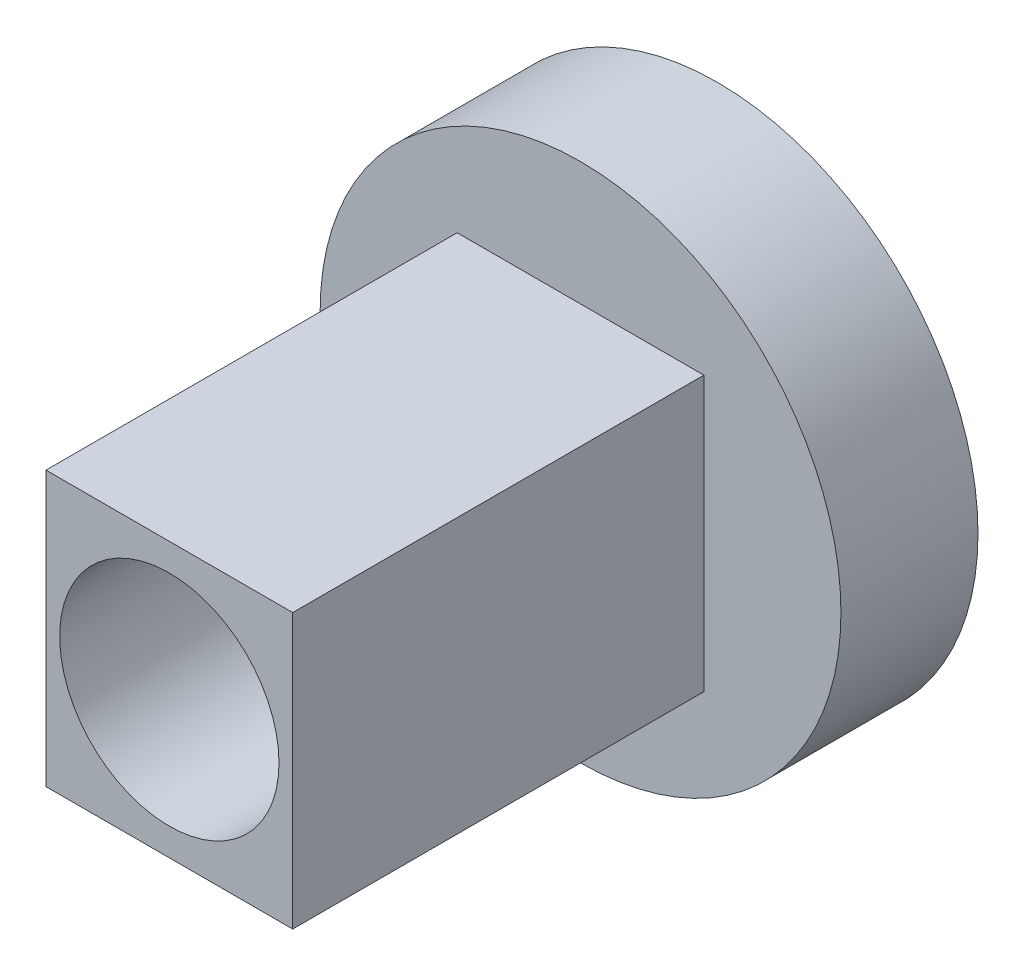
ISO-10303-21;
HEADER;
FILE_DESCRIPTION(('STEP AP214'),'2;1');
FILE_NAME('part.step','',(''),(''),'','','');
FILE_SCHEMA(('AUTOMOTIVE_DESIGN { 1 0 10303 214 1 1 1 1 }'));
ENDSEC;
DATA;
#1=APPLICATION_CONTEXT('core data for automotive mechanical design processes');
#2=APPLICATION_PROTOCOL_DEFINITION('international standard','automotive_design',2000,#1);
#3=PRODUCT_CONTEXT('',#1,'mechanical');
#4=PRODUCT('Part','Part','',(#3));
#5=PRODUCT_RELATED_PRODUCT_CATEGORY('part','',(#4));
#6=PRODUCT_DEFINITION_FORMATION('','',#4);
#7=PRODUCT_DEFINITION_CONTEXT('part definition',#1,'design');
#8=PRODUCT_DEFINITION('design','',#6,#7);
#9=PRODUCT_DEFINITION_SHAPE('','',#8);
#10=(LENGTH_UNIT() NAMED_UNIT(*) SI_UNIT(.MILLI.,.METRE.));
#11=(NAMED_UNIT(*) PLANE_ANGLE_UNIT() SI_UNIT($,.RADIAN.));
#12=(NAMED_UNIT(*) SI_UNIT($,.STERADIAN.) SOLID_ANGLE_UNIT());
#13=UNCERTAINTY_MEASURE_WITH_UNIT(LENGTH_MEASURE(1.E-05),#10,'distance_accuracy_value','');
#14=(GEOMETRIC_REPRESENTATION_CONTEXT(3) GLOBAL_UNCERTAINTY_ASSIGNED_CONTEXT((#13)) GLOBAL_UNIT_ASSIGNED_CONTEXT((#10,
#11,#12)) REPRESENTATION_CONTEXT('',''));
#15=CARTESIAN_POINT('',(0.,0.,0.));
#16=DIRECTION('',(0.,0.,1.));
#17=DIRECTION('',(1.,0.,0.));
#18=AXIS2_PLACEMENT_3D('',#15,#16,#17);
#19=CARTESIAN_POINT('',(0.,0.,0.));
#20=DIRECTION('',(0.,0.,1.));
#21=DIRECTION('',(1.,0.,0.));
#22=AXIS2_PLACEMENT_3D('',#19,#20,#21);
#23=PLANE('',#22);
#24=CARTESIAN_POINT('',(0.,0.,0.));
#25=DIRECTION('',(0.,0.,1.));
#26=DIRECTION('',(1.,0.,0.));
#27=AXIS2_PLACEMENT_3D('',#24,#25,#26);
#28=CIRCLE('',#27,40.);
#29=CARTESIAN_POINT('',(40.,0.,0.));
#30=VERTEX_POINT('',#29);
#31=EDGE_CURVE('E203',#30,#30,#28,.T.);
#32=ORIENTED_EDGE('',*,*,#31,.T.);
#33=EDGE_LOOP('',(#32));
#34=FACE_BOUND('',#33,.T.);
#35=CARTESIAN_POINT('',(0.,0.,0.));
#36=DIRECTION('',(0.,0.,1.));
#37=DIRECTION('',(1.,0.,0.));
#38=AXIS2_PLACEMENT_3D('',#35,#36,#37);
#39=CIRCLE('',#38,43.);
#40=CARTESIAN_POINT('',(43.,0.,0.));
#41=VERTEX_POINT('',#40);
#42=EDGE_CURVE('E183',#41,#41,#39,.T.);
#43=ORIENTED_EDGE('',*,*,#42,.F.);
#44=EDGE_LOOP('',(#43));
#45=FACE_BOUND('',#44,.T.);
#46=ADVANCED_FACE('F35',(#34,#45),#23,.F.);
#47=CARTESIAN_POINT('',(0.,0.,50.));
#48=DIRECTION('',(0.,0.,1.));
#49=DIRECTION('',(1.,0.,0.));
#50=AXIS2_PLACEMENT_3D('',#47,#48,#49);
#51=PLANE('',#50);
#52=CARTESIAN_POINT('',(0.,0.,50.));
#53=DIRECTION('',(0.,0.,1.));
#54=DIRECTION('',(1.,0.,0.));
#55=AXIS2_PLACEMENT_3D('',#52,#53,#54);
#56=CIRCLE('',#55,95.);
#57=CARTESIAN_POINT('',(95.,0.,50.));
#58=VERTEX_POINT('',#57);
#59=EDGE_CURVE('E11',#58,#58,#56,.T.);
#60=ORIENTED_EDGE('',*,*,#59,.T.);
#61=EDGE_LOOP('',(#60));
#62=FACE_BOUND('',#61,.T.);
#63=DIRECTION('',(-1.,0.,0.));
#64=VECTOR('',#63,1.);
#65=CARTESIAN_POINT('',(-45.,50.,50.));
#66=LINE('',#65,#64);
#67=CARTESIAN_POINT('',(45.,50.,50.));
#68=VERTEX_POINT('',#67);
#69=CARTESIAN_POINT('',(-45.,50.,50.));
#70=VERTEX_POINT('',#69);
#71=EDGE_CURVE('E219',#68,#70,#66,.T.);
#72=ORIENTED_EDGE('',*,*,#71,.F.);
#73=DIRECTION('',(0.,1.,0.));
#74=VECTOR('',#73,1.);
#75=CARTESIAN_POINT('',(45.,-50.,50.));
#76=LINE('',#75,#74);
#77=CARTESIAN_POINT('',(45.,-50.,50.));
#78=VERTEX_POINT('',#77);
#79=EDGE_CURVE('E206',#78,#68,#76,.T.);
#80=ORIENTED_EDGE('',*,*,#79,.F.);
#81=DIRECTION('',(1.,0.,0.));
#82=VECTOR('',#81,1.);
#83=CARTESIAN_POINT('',(-45.,-50.,50.));
#84=LINE('',#83,#82);
#85=CARTESIAN_POINT('',(-45.,-50.,50.));
#86=VERTEX_POINT('',#85);
#87=EDGE_CURVE('E73',#86,#78,#84,.T.);
#88=ORIENTED_EDGE('',*,*,#87,.F.);
#89=DIRECTION('',(0.,-1.,0.));
#90=VECTOR('',#89,1.);
#91=CARTESIAN_POINT('',(-45.,-50.,50.));
#92=LINE('',#91,#90);
#93=EDGE_CURVE('E221',#70,#86,#92,.T.);
#94=ORIENTED_EDGE('',*,*,#93,.F.);
#95=EDGE_LOOP('',(#72,#80,#88,#94));
#96=FACE_BOUND('',#95,.T.);
#97=ADVANCED_FACE('F246',(#62,#96),#51,.T.);
#98=CARTESIAN_POINT('',(0.,0.,50.));
#99=DIRECTION('',(0.,0.,-1.));
#100=DIRECTION('',(-1.,0.,0.));
#101=AXIS2_PLACEMENT_3D('',#98,#99,#100);
#102=CYLINDRICAL_SURFACE('',#101,95.);
#103=ORIENTED_EDGE('',*,*,#59,.F.);
#104=EDGE_LOOP('',(#103));
#105=FACE_BOUND('',#104,.T.);
#106=CARTESIAN_POINT('',(0.,0.,0.));
#107=DIRECTION('',(0.,0.,1.));
#108=DIRECTION('',(1.,0.,0.));
#109=AXIS2_PLACEMENT_3D('',#106,#107,#108);
#110=CIRCLE('',#109,95.);
#111=CARTESIAN_POINT('',(95.,0.,0.));
#112=VERTEX_POINT('',#111);
#113=EDGE_CURVE('E39',#112,#112,#110,.T.);
#114=ORIENTED_EDGE('',*,*,#113,.T.);
#115=EDGE_LOOP('',(#114));
#116=FACE_BOUND('',#115,.T.);
#117=ADVANCED_FACE('F37',(#105,#116),#102,.T.);
#118=CARTESIAN_POINT('',(0.,0.,0.));
#119=DIRECTION('',(0.,0.,1.));
#120=DIRECTION('',(1.,0.,0.));
#121=AXIS2_PLACEMENT_3D('',#118,#119,#120);
#122=CIRCLE('',#121,92.);
#123=CARTESIAN_POINT('',(92.,0.,0.));
#124=VERTEX_POINT('',#123);
#125=EDGE_CURVE('E165',#124,#124,#122,.T.);
#126=ORIENTED_EDGE('',*,*,#125,.T.);
#127=EDGE_LOOP('',(#126));
#128=FACE_BOUND('',#127,.T.);
#129=ORIENTED_EDGE('',*,*,#113,.F.);
#130=EDGE_LOOP('',(#129));
#131=FACE_BOUND('',#130,.T.);
#132=ADVANCED_FACE('F235',(#128,#131),#23,.F.);
#133=CARTESIAN_POINT('',(45.,-50.,200.));
#134=DIRECTION('',(-1.,0.,0.));
#135=DIRECTION('',(0.,0.,1.));
#136=AXIS2_PLACEMENT_3D('',#133,#134,#135);
#137=PLANE('',#136);
#138=ORIENTED_EDGE('',*,*,#79,.T.);
#139=DIRECTION('',(0.,0.,-1.));
#140=VECTOR('',#139,1.);
#141=CARTESIAN_POINT('',(45.,50.,200.));
#142=LINE('',#141,#140);
#143=CARTESIAN_POINT('',(45.,50.,200.));
#144=VERTEX_POINT('',#143);
#145=EDGE_CURVE('E229',#144,#68,#142,.T.);
#146=ORIENTED_EDGE('',*,*,#145,.F.);
#147=DIRECTION('',(0.,1.,0.));
#148=VECTOR('',#147,1.);
#149=CARTESIAN_POINT('',(45.,-50.,200.));
#150=LINE('',#149,#148);
#151=CARTESIAN_POINT('',(45.,-50.,200.));
#152=VERTEX_POINT('',#151);
#153=EDGE_CURVE('E210',#152,#144,#150,.T.);
#154=ORIENTED_EDGE('',*,*,#153,.F.);
#155=DIRECTION('',(0.,0.,-1.));
#156=VECTOR('',#155,1.);
#157=CARTESIAN_POINT('',(45.,-50.,200.));
#158=LINE('',#157,#156);
#159=EDGE_CURVE('E216',#152,#78,#158,.T.);
#160=ORIENTED_EDGE('',*,*,#159,.T.);
#161=EDGE_LOOP('',(#138,#146,#154,#160));
#162=FACE_BOUND('',#161,.T.);
#163=ADVANCED_FACE('F237',(#162),#137,.F.);
#164=CARTESIAN_POINT('',(-45.,50.,200.));
#165=DIRECTION('',(0.,-1.,0.));
#166=DIRECTION('',(0.,0.,-1.));
#167=AXIS2_PLACEMENT_3D('',#164,#165,#166);
#168=PLANE('',#167);
#169=ORIENTED_EDGE('',*,*,#71,.T.);
#170=DIRECTION('',(0.,0.,-1.));
#171=VECTOR('',#170,1.);
#172=CARTESIAN_POINT('',(-45.,50.,200.));
#173=LINE('',#172,#171);
#174=CARTESIAN_POINT('',(-45.,50.,200.));
#175=VERTEX_POINT('',#174);
#176=EDGE_CURVE('E226',#175,#70,#173,.T.);
#177=ORIENTED_EDGE('',*,*,#176,.F.);
#178=DIRECTION('',(-1.,0.,0.));
#179=VECTOR('',#178,1.);
#180=CARTESIAN_POINT('',(-45.,50.,200.));
#181=LINE('',#180,#179);
#182=EDGE_CURVE('E80',#144,#175,#181,.T.);
#183=ORIENTED_EDGE('',*,*,#182,.F.);
#184=ORIENTED_EDGE('',*,*,#145,.T.);
#185=EDGE_LOOP('',(#169,#177,#183,#184));
#186=FACE_BOUND('',#185,.T.);
#187=ADVANCED_FACE('F243',(#186),#168,.F.);
#188=CARTESIAN_POINT('',(-45.,-50.,200.));
#189=DIRECTION('',(1.,0.,0.));
#190=DIRECTION('',(0.,0.,-1.));
#191=AXIS2_PLACEMENT_3D('',#188,#189,#190);
#192=PLANE('',#191);
#193=ORIENTED_EDGE('',*,*,#93,.T.);
#194=DIRECTION('',(0.,0.,-1.));
#195=VECTOR('',#194,1.);
#196=CARTESIAN_POINT('',(-45.,-50.,200.));
#197=LINE('',#196,#195);
#198=CARTESIAN_POINT('',(-45.,-50.,200.));
#199=VERTEX_POINT('',#198);
#200=EDGE_CURVE('E50',#199,#86,#197,.T.);
#201=ORIENTED_EDGE('',*,*,#200,.F.);
#202=DIRECTION('',(0.,-1.,0.));
#203=VECTOR('',#202,1.);
#204=CARTESIAN_POINT('',(-45.,-50.,200.));
#205=LINE('',#204,#203);
#206=EDGE_CURVE('E213',#175,#199,#205,.T.);
#207=ORIENTED_EDGE('',*,*,#206,.F.);
#208=ORIENTED_EDGE('',*,*,#176,.T.);
#209=EDGE_LOOP('',(#193,#201,#207,#208));
#210=FACE_BOUND('',#209,.T.);
#211=ADVANCED_FACE('F322',(#210),#192,.F.);
#212=CARTESIAN_POINT('',(-45.,-50.,200.));
#213=DIRECTION('',(0.,1.,0.));
#214=DIRECTION('',(0.,0.,1.));
#215=AXIS2_PLACEMENT_3D('',#212,#213,#214);
#216=PLANE('',#215);
#217=ORIENTED_EDGE('',*,*,#87,.T.);
#218=ORIENTED_EDGE('',*,*,#159,.F.);
#219=DIRECTION('',(1.,0.,0.));
#220=VECTOR('',#219,1.);
#221=CARTESIAN_POINT('',(-45.,-50.,200.));
#222=LINE('',#221,#220);
#223=EDGE_CURVE('E58',#199,#152,#222,.T.);
#224=ORIENTED_EDGE('',*,*,#223,.F.);
#225=ORIENTED_EDGE('',*,*,#200,.T.);
#226=EDGE_LOOP('',(#217,#218,#224,#225));
#227=FACE_BOUND('',#226,.T.);
#228=ADVANCED_FACE('F318',(#227),#216,.F.);
#229=CARTESIAN_POINT('',(0.,0.,200.));
#230=DIRECTION('',(0.,0.,-1.));
#231=DIRECTION('',(-1.,0.,0.));
#232=AXIS2_PLACEMENT_3D('',#229,#230,#231);
#233=PLANE('',#232);
#234=CARTESIAN_POINT('',(0.,0.,200.));
#235=DIRECTION('',(0.,0.,1.));
#236=DIRECTION('',(1.,0.,0.));
#237=AXIS2_PLACEMENT_3D('',#234,#235,#236);
#238=CIRCLE('',#237,40.);
#239=CARTESIAN_POINT('',(40.,0.,200.));
#240=VERTEX_POINT('',#239);
#241=EDGE_CURVE('E207',#240,#240,#238,.T.);
#242=ORIENTED_EDGE('',*,*,#241,.F.);
#243=EDGE_LOOP('',(#242));
#244=FACE_BOUND('',#243,.T.);
#245=ORIENTED_EDGE('',*,*,#153,.T.);
#246=ORIENTED_EDGE('',*,*,#182,.T.);
#247=ORIENTED_EDGE('',*,*,#206,.T.);
#248=ORIENTED_EDGE('',*,*,#223,.T.);
#249=EDGE_LOOP('',(#245,#246,#247,#248));
#250=FACE_BOUND('',#249,.T.);
#251=ADVANCED_FACE('F314',(#244,#250),#233,.F.);
#252=CARTESIAN_POINT('',(0.,0.,0.));
#253=DIRECTION('',(0.,0.,1.));
#254=DIRECTION('',(1.,0.,0.));
#255=AXIS2_PLACEMENT_3D('',#252,#253,#254);
#256=CYLINDRICAL_SURFACE('',#255,40.);
#257=ORIENTED_EDGE('',*,*,#31,.F.);
#258=EDGE_LOOP('',(#257));
#259=FACE_BOUND('',#258,.T.);
#260=ORIENTED_EDGE('',*,*,#241,.T.);
#261=EDGE_LOOP('',(#260));
#262=FACE_BOUND('',#261,.T.);
#263=ADVANCED_FACE('F262',(#259,#262),#256,.F.);
#264=CARTESIAN_POINT('',(0.,0.,0.));
#265=DIRECTION('',(0.,0.,1.));
#266=DIRECTION('',(1.,0.,0.));
#267=AXIS2_PLACEMENT_3D('',#264,#265,#266);
#268=CYLINDRICAL_SURFACE('',#267,43.);
#269=ORIENTED_EDGE('',*,*,#42,.T.);
#270=EDGE_LOOP('',(#269));
#271=FACE_BOUND('',#270,.T.);
#272=CARTESIAN_POINT('',(0.,0.,47.));
#273=DIRECTION('',(0.,0.,1.));
#274=DIRECTION('',(1.,0.,0.));
#275=AXIS2_PLACEMENT_3D('',#272,#273,#274);
#276=CIRCLE('',#275,43.);
#277=CARTESIAN_POINT('',(-42.,-9.21954445729296,47.));
#278=VERTEX_POINT('',#277);
#279=CARTESIAN_POINT('',(-42.,9.21954445729296,47.));
#280=VERTEX_POINT('',#279);
#281=EDGE_CURVE('E202',#278,#280,#276,.F.);
#282=ORIENTED_EDGE('',*,*,#281,.T.);
#283=DIRECTION('',(0.,0.,1.));
#284=VECTOR('',#283,1.);
#285=CARTESIAN_POINT('',(-42.,9.21954445729296,0.));
#286=LINE('',#285,#284);
#287=CARTESIAN_POINT('',(-42.,9.21954445729296,197.));
#288=VERTEX_POINT('',#287);
#289=EDGE_CURVE('E156',#288,#280,#286,.F.);
#290=ORIENTED_EDGE('',*,*,#289,.F.);
#291=CARTESIAN_POINT('',(0.,0.,197.));
#292=DIRECTION('',(0.,0.,-1.));
#293=DIRECTION('',(-1.,0.,0.));
#294=AXIS2_PLACEMENT_3D('',#291,#292,#293);
#295=CIRCLE('',#294,43.);
#296=CARTESIAN_POINT('',(42.,9.2195444572929,197.));
#297=VERTEX_POINT('',#296);
#298=EDGE_CURVE('E180',#297,#288,#295,.F.);
#299=ORIENTED_EDGE('',*,*,#298,.F.);
#300=DIRECTION('',(0.,0.,1.));
#301=VECTOR('',#300,1.);
#302=CARTESIAN_POINT('',(42.,9.2195444572929,0.));
#303=LINE('',#302,#301);
#304=CARTESIAN_POINT('',(42.,9.2195444572929,47.));
#305=VERTEX_POINT('',#304);
#306=EDGE_CURVE('E190',#297,#305,#303,.F.);
#307=ORIENTED_EDGE('',*,*,#306,.T.);
#308=CARTESIAN_POINT('',(42.,-9.2195444572929,47.));
#309=VERTEX_POINT('',#308);
#310=EDGE_CURVE('E199',#305,#309,#276,.F.);
#311=ORIENTED_EDGE('',*,*,#310,.T.);
#312=DIRECTION('',(0.,0.,1.));
#313=VECTOR('',#312,1.);
#314=CARTESIAN_POINT('',(42.,-9.2195444572929,0.));
#315=LINE('',#314,#313);
#316=CARTESIAN_POINT('',(42.,-9.2195444572929,197.));
#317=VERTEX_POINT('',#316);
#318=EDGE_CURVE('E193',#317,#309,#315,.F.);
#319=ORIENTED_EDGE('',*,*,#318,.F.);
#320=CARTESIAN_POINT('',(-42.,-9.21954445729296,197.));
#321=VERTEX_POINT('',#320);
#322=EDGE_CURVE('E184',#321,#317,#295,.F.);
#323=ORIENTED_EDGE('',*,*,#322,.F.);
#324=DIRECTION('',(0.,0.,1.));
#325=VECTOR('',#324,1.);
#326=CARTESIAN_POINT('',(-42.,-9.21954445729296,0.));
#327=LINE('',#326,#325);
#328=EDGE_CURVE('E195',#321,#278,#327,.F.);
#329=ORIENTED_EDGE('',*,*,#328,.T.);
#330=EDGE_LOOP('',(#282,#290,#299,#307,#311,#319,#323,#329));
#331=FACE_BOUND('',#330,.T.);
#332=ADVANCED_FACE('F259',(#271,#331),#268,.T.);
#333=CARTESIAN_POINT('',(-42.,-50.,200.));
#334=DIRECTION('',(1.,0.,0.));
#335=DIRECTION('',(0.,0.,-1.));
#336=AXIS2_PLACEMENT_3D('',#333,#334,#335);
#337=PLANE('',#336);
#338=ORIENTED_EDGE('',*,*,#289,.T.);
#339=DIRECTION('',(0.,-1.,0.));
#340=VECTOR('',#339,1.);
#341=CARTESIAN_POINT('',(-42.,-50.,47.));
#342=LINE('',#341,#340);
#343=CARTESIAN_POINT('',(-42.,47.,47.));
#344=VERTEX_POINT('',#343);
#345=EDGE_CURVE('E135',#344,#280,#342,.T.);
#346=ORIENTED_EDGE('',*,*,#345,.F.);
#347=DIRECTION('',(0.,0.,-1.));
#348=VECTOR('',#347,1.);
#349=CARTESIAN_POINT('',(-42.,47.,200.));
#350=LINE('',#349,#348);
#351=CARTESIAN_POINT('',(-42.,47.,197.));
#352=VERTEX_POINT('',#351);
#353=EDGE_CURVE('E145',#352,#344,#350,.T.);
#354=ORIENTED_EDGE('',*,*,#353,.F.);
#355=DIRECTION('',(0.,-1.,0.));
#356=VECTOR('',#355,1.);
#357=CARTESIAN_POINT('',(-42.,0.,197.));
#358=LINE('',#357,#356);
#359=EDGE_CURVE('E177',#352,#288,#358,.T.);
#360=ORIENTED_EDGE('',*,*,#359,.T.);
#361=EDGE_LOOP('',(#338,#346,#354,#360));
#362=FACE_BOUND('',#361,.T.);
#363=ADVANCED_FACE('F155',(#362),#337,.T.);
#364=CARTESIAN_POINT('',(42.,-50.,200.));
#365=DIRECTION('',(-1.,0.,0.));
#366=DIRECTION('',(0.,0.,1.));
#367=AXIS2_PLACEMENT_3D('',#364,#365,#366);
#368=PLANE('',#367);
#369=ORIENTED_EDGE('',*,*,#318,.T.);
#370=DIRECTION('',(0.,1.,0.));
#371=VECTOR('',#370,1.);
#372=CARTESIAN_POINT('',(42.,-50.,47.));
#373=LINE('',#372,#371);
#374=CARTESIAN_POINT('',(42.,-47.,47.));
#375=VERTEX_POINT('',#374);
#376=EDGE_CURVE('E142',#375,#309,#373,.T.);
#377=ORIENTED_EDGE('',*,*,#376,.F.);
#378=DIRECTION('',(0.,0.,-1.));
#379=VECTOR('',#378,1.);
#380=CARTESIAN_POINT('',(42.,-47.,200.));
#381=LINE('',#380,#379);
#382=CARTESIAN_POINT('',(42.,-47.,197.));
#383=VERTEX_POINT('',#382);
#384=EDGE_CURVE('E169',#383,#375,#381,.T.);
#385=ORIENTED_EDGE('',*,*,#384,.F.);
#386=DIRECTION('',(0.,1.,0.));
#387=VECTOR('',#386,1.);
#388=CARTESIAN_POINT('',(42.,0.,197.));
#389=LINE('',#388,#387);
#390=EDGE_CURVE('E166',#383,#317,#389,.T.);
#391=ORIENTED_EDGE('',*,*,#390,.T.);
#392=EDGE_LOOP('',(#369,#377,#385,#391));
#393=FACE_BOUND('',#392,.T.);
#394=ADVANCED_FACE('F280',(#393),#368,.T.);
#395=CARTESIAN_POINT('',(0.,0.,197.));
#396=DIRECTION('',(0.,0.,-1.));
#397=DIRECTION('',(-1.,0.,0.));
#398=AXIS2_PLACEMENT_3D('',#395,#396,#397);
#399=PLANE('',#398);
#400=ORIENTED_EDGE('',*,*,#298,.T.);
#401=ORIENTED_EDGE('',*,*,#359,.F.);
#402=DIRECTION('',(-1.,0.,0.));
#403=VECTOR('',#402,1.);
#404=CARTESIAN_POINT('',(0.,47.,197.));
#405=LINE('',#404,#403);
#406=CARTESIAN_POINT('',(42.,47.,197.));
#407=VERTEX_POINT('',#406);
#408=EDGE_CURVE('E148',#407,#352,#405,.T.);
#409=ORIENTED_EDGE('',*,*,#408,.F.);
#410=EDGE_CURVE('E160',#297,#407,#389,.T.);
#411=ORIENTED_EDGE('',*,*,#410,.F.);
#412=EDGE_LOOP('',(#400,#401,#409,#411));
#413=FACE_BOUND('',#412,.T.);
#414=ADVANCED_FACE('F289',(#413),#399,.T.);
#415=CARTESIAN_POINT('',(0.,0.,47.));
#416=DIRECTION('',(0.,0.,1.));
#417=DIRECTION('',(1.,0.,0.));
#418=AXIS2_PLACEMENT_3D('',#415,#416,#417);
#419=PLANE('',#418);
#420=CARTESIAN_POINT('',(0.,0.,47.));
#421=DIRECTION('',(0.,0.,1.));
#422=DIRECTION('',(1.,0.,0.));
#423=AXIS2_PLACEMENT_3D('',#420,#421,#422);
#424=CIRCLE('',#423,92.);
#425=CARTESIAN_POINT('',(92.,0.,47.));
#426=VERTEX_POINT('',#425);
#427=EDGE_CURVE('E187',#426,#426,#424,.T.);
#428=ORIENTED_EDGE('',*,*,#427,.F.);
#429=EDGE_LOOP('',(#428));
#430=FACE_BOUND('',#429,.T.);
#431=CARTESIAN_POINT('',(-42.,-47.,47.));
#432=VERTEX_POINT('',#431);
#433=EDGE_CURVE('E141',#278,#432,#342,.T.);
#434=ORIENTED_EDGE('',*,*,#433,.T.);
#435=DIRECTION('',(1.,0.,0.));
#436=VECTOR('',#435,1.);
#437=CARTESIAN_POINT('',(-45.,-47.,47.));
#438=LINE('',#437,#436);
#439=EDGE_CURVE('E158',#432,#375,#438,.T.);
#440=ORIENTED_EDGE('',*,*,#439,.T.);
#441=ORIENTED_EDGE('',*,*,#376,.T.);
#442=ORIENTED_EDGE('',*,*,#310,.F.);
#443=CARTESIAN_POINT('',(42.,47.,47.));
#444=VERTEX_POINT('',#443);
#445=EDGE_CURVE('E137',#305,#444,#373,.T.);
#446=ORIENTED_EDGE('',*,*,#445,.T.);
#447=DIRECTION('',(-1.,0.,0.));
#448=VECTOR('',#447,1.);
#449=CARTESIAN_POINT('',(-45.,47.,47.));
#450=LINE('',#449,#448);
#451=EDGE_CURVE('E131',#444,#344,#450,.T.);
#452=ORIENTED_EDGE('',*,*,#451,.T.);
#453=ORIENTED_EDGE('',*,*,#345,.T.);
#454=ORIENTED_EDGE('',*,*,#281,.F.);
#455=EDGE_LOOP('',(#434,#440,#441,#442,#446,#452,#453,#454));
#456=FACE_BOUND('',#455,.T.);
#457=ADVANCED_FACE('F133',(#430,#456),#419,.F.);
#458=CARTESIAN_POINT('',(0.,0.,50.));
#459=DIRECTION('',(0.,0.,-1.));
#460=DIRECTION('',(-1.,0.,0.));
#461=AXIS2_PLACEMENT_3D('',#458,#459,#460);
#462=CYLINDRICAL_SURFACE('',#461,92.);
#463=ORIENTED_EDGE('',*,*,#427,.T.);
#464=EDGE_LOOP('',(#463));
#465=FACE_BOUND('',#464,.T.);
#466=ORIENTED_EDGE('',*,*,#125,.F.);
#467=EDGE_LOOP('',(#466));
#468=FACE_BOUND('',#467,.T.);
#469=ADVANCED_FACE('F285',(#465,#468),#462,.F.);
#470=ORIENTED_EDGE('',*,*,#410,.T.);
#471=DIRECTION('',(0.,0.,-1.));
#472=VECTOR('',#471,1.);
#473=CARTESIAN_POINT('',(42.,47.,200.));
#474=LINE('',#473,#472);
#475=EDGE_CURVE('E152',#407,#444,#474,.T.);
#476=ORIENTED_EDGE('',*,*,#475,.T.);
#477=ORIENTED_EDGE('',*,*,#445,.F.);
#478=ORIENTED_EDGE('',*,*,#306,.F.);
#479=EDGE_LOOP('',(#470,#476,#477,#478));
#480=FACE_BOUND('',#479,.T.);
#481=ADVANCED_FACE('F295',(#480),#368,.T.);
#482=CARTESIAN_POINT('',(-45.,47.,200.));
#483=DIRECTION('',(0.,-1.,0.));
#484=DIRECTION('',(0.,0.,-1.));
#485=AXIS2_PLACEMENT_3D('',#482,#483,#484);
#486=PLANE('',#485);
#487=ORIENTED_EDGE('',*,*,#451,.F.);
#488=ORIENTED_EDGE('',*,*,#475,.F.);
#489=ORIENTED_EDGE('',*,*,#408,.T.);
#490=ORIENTED_EDGE('',*,*,#353,.T.);
#491=EDGE_LOOP('',(#487,#488,#489,#490));
#492=FACE_BOUND('',#491,.T.);
#493=ADVANCED_FACE('F146',(#492),#486,.T.);
#494=CARTESIAN_POINT('',(-42.,-47.,197.));
#495=VERTEX_POINT('',#494);
#496=EDGE_CURVE('E174',#321,#495,#358,.T.);
#497=ORIENTED_EDGE('',*,*,#496,.T.);
#498=DIRECTION('',(0.,0.,-1.));
#499=VECTOR('',#498,1.);
#500=CARTESIAN_POINT('',(-42.,-47.,200.));
#501=LINE('',#500,#499);
#502=EDGE_CURVE('E153',#495,#432,#501,.T.);
#503=ORIENTED_EDGE('',*,*,#502,.T.);
#504=ORIENTED_EDGE('',*,*,#433,.F.);
#505=ORIENTED_EDGE('',*,*,#328,.F.);
#506=EDGE_LOOP('',(#497,#503,#504,#505));
#507=FACE_BOUND('',#506,.T.);
#508=ADVANCED_FACE('F271',(#507),#337,.T.);
#509=CARTESIAN_POINT('',(-45.,-47.,200.));
#510=DIRECTION('',(0.,1.,0.));
#511=DIRECTION('',(0.,0.,1.));
#512=AXIS2_PLACEMENT_3D('',#509,#510,#511);
#513=PLANE('',#512);
#514=ORIENTED_EDGE('',*,*,#439,.F.);
#515=ORIENTED_EDGE('',*,*,#502,.F.);
#516=DIRECTION('',(1.,0.,0.));
#517=VECTOR('',#516,1.);
#518=CARTESIAN_POINT('',(0.,-47.,197.));
#519=LINE('',#518,#517);
#520=EDGE_CURVE('E171',#495,#383,#519,.T.);
#521=ORIENTED_EDGE('',*,*,#520,.T.);
#522=ORIENTED_EDGE('',*,*,#384,.T.);
#523=EDGE_LOOP('',(#514,#515,#521,#522));
#524=FACE_BOUND('',#523,.T.);
#525=ADVANCED_FACE('F275',(#524),#513,.T.);
#526=ORIENTED_EDGE('',*,*,#390,.F.);
#527=ORIENTED_EDGE('',*,*,#520,.F.);
#528=ORIENTED_EDGE('',*,*,#496,.F.);
#529=ORIENTED_EDGE('',*,*,#322,.T.);
#530=EDGE_LOOP('',(#526,#527,#528,#529));
#531=FACE_BOUND('',#530,.T.);
#532=ADVANCED_FACE('F299',(#531),#399,.T.);
#533=CLOSED_SHELL('',(#46,#97,#117,#132,#163,#187,#211,#228,#251,#263,#332,#363,#394,#414,#457,
#469,#481,#493,#508,#525,#532));
#534=MANIFOLD_SOLID_BREP('B2',#533);
#535=ADVANCED_BREP_SHAPE_REPRESENTATION('',(#18,#534),#14);
#536=SHAPE_DEFINITION_REPRESENTATION(#9,#535);
ENDSEC;
END-ISO-10303-21;
